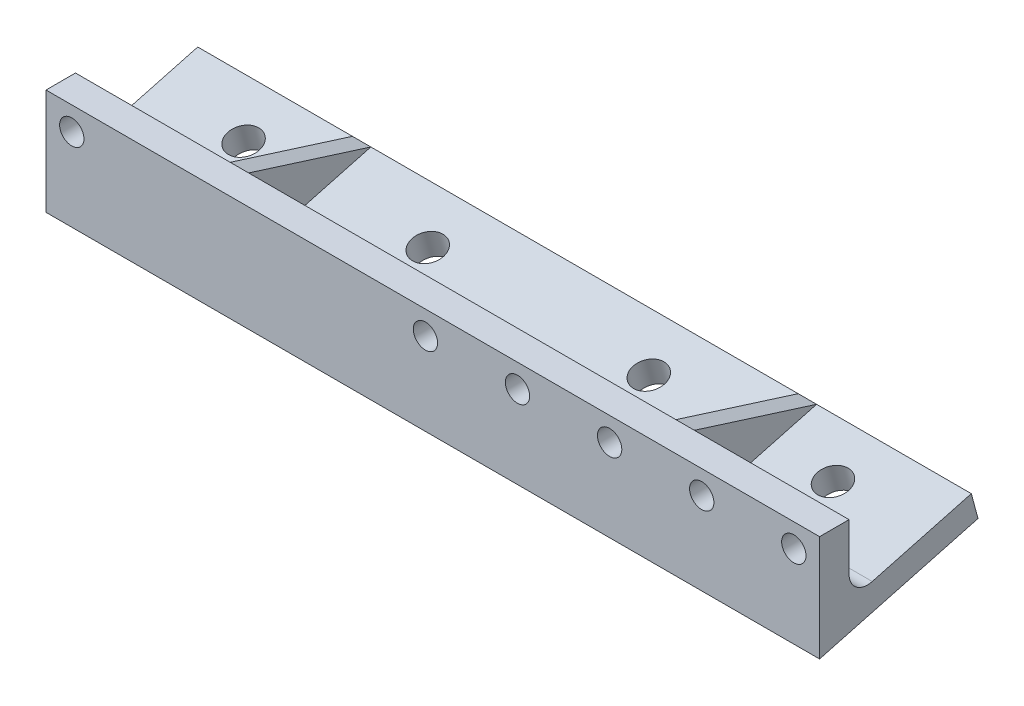
ISO-10303-21;
HEADER;
FILE_DESCRIPTION(('STEP AP214'),'2;1');
FILE_NAME('part.step','',(''),(''),'','','');
FILE_SCHEMA(('AUTOMOTIVE_DESIGN { 1 0 10303 214 1 1 1 1 }'));
ENDSEC;
DATA;
#1=APPLICATION_CONTEXT('core data for automotive mechanical design processes');
#2=APPLICATION_PROTOCOL_DEFINITION('international standard','automotive_design',2000,#1);
#3=PRODUCT_CONTEXT('',#1,'mechanical');
#4=PRODUCT('Part','Part','',(#3));
#5=PRODUCT_RELATED_PRODUCT_CATEGORY('part','',(#4));
#6=PRODUCT_DEFINITION_FORMATION('','',#4);
#7=PRODUCT_DEFINITION_CONTEXT('part definition',#1,'design');
#8=PRODUCT_DEFINITION('design','',#6,#7);
#9=PRODUCT_DEFINITION_SHAPE('','',#8);
#10=(LENGTH_UNIT() NAMED_UNIT(*) SI_UNIT(.MILLI.,.METRE.));
#11=(NAMED_UNIT(*) PLANE_ANGLE_UNIT() SI_UNIT($,.RADIAN.));
#12=(NAMED_UNIT(*) SI_UNIT($,.STERADIAN.) SOLID_ANGLE_UNIT());
#13=UNCERTAINTY_MEASURE_WITH_UNIT(LENGTH_MEASURE(1.E-05),#10,'distance_accuracy_value','');
#14=(GEOMETRIC_REPRESENTATION_CONTEXT(3) GLOBAL_UNCERTAINTY_ASSIGNED_CONTEXT((#13)) GLOBAL_UNIT_ASSIGNED_CONTEXT((#10,
#11,#12)) REPRESENTATION_CONTEXT('',''));
#15=CARTESIAN_POINT('',(0.,0.,0.));
#16=DIRECTION('',(0.,0.,1.));
#17=DIRECTION('',(1.,0.,0.));
#18=AXIS2_PLACEMENT_3D('',#15,#16,#17);
#19=CARTESIAN_POINT('',(158.,10.6217782649107,-60.));
#20=DIRECTION('',(0.,0.,1.));
#21=DIRECTION('',(1.,0.,0.));
#22=AXIS2_PLACEMENT_3D('',#19,#20,#21);
#23=PLANE('',#22);
#24=CARTESIAN_POINT('',(51.,23.65,-60.));
#25=DIRECTION('',(0.,0.,-1.));
#26=DIRECTION('',(-1.,0.,0.));
#27=AXIS2_PLACEMENT_3D('',#24,#25,#26);
#28=CIRCLE('',#27,3.3);
#29=CARTESIAN_POINT('',(47.7,23.65,-60.));
#30=VERTEX_POINT('',#29);
#31=EDGE_CURVE('E200',#30,#30,#28,.T.);
#32=ORIENTED_EDGE('',*,*,#31,.F.);
#33=EDGE_LOOP('',(#32));
#34=FACE_BOUND('',#33,.T.);
#35=CARTESIAN_POINT('',(76.,23.65,-60.));
#36=DIRECTION('',(0.,0.,-1.));
#37=DIRECTION('',(-1.,0.,0.));
#38=AXIS2_PLACEMENT_3D('',#35,#36,#37);
#39=CIRCLE('',#38,3.29999999999999);
#40=CARTESIAN_POINT('',(72.7,23.65,-60.));
#41=VERTEX_POINT('',#40);
#42=EDGE_CURVE('E229',#41,#41,#39,.T.);
#43=ORIENTED_EDGE('',*,*,#42,.F.);
#44=EDGE_LOOP('',(#43));
#45=FACE_BOUND('',#44,.T.);
#46=CARTESIAN_POINT('',(101.,23.65,-60.));
#47=DIRECTION('',(0.,0.,-1.));
#48=DIRECTION('',(-1.,0.,0.));
#49=AXIS2_PLACEMENT_3D('',#46,#47,#48);
#50=CIRCLE('',#49,3.3);
#51=CARTESIAN_POINT('',(97.7,23.65,-60.));
#52=VERTEX_POINT('',#51);
#53=EDGE_CURVE('E223',#52,#52,#50,.T.);
#54=ORIENTED_EDGE('',*,*,#53,.F.);
#55=EDGE_LOOP('',(#54));
#56=FACE_BOUND('',#55,.T.);
#57=DIRECTION('',(0.,1.,0.));
#58=VECTOR('',#57,1.);
#59=CARTESIAN_POINT('',(-4.99999999999999,26.2748809496813,-60.));
#60=LINE('',#59,#58);
#61=CARTESIAN_POINT('',(-4.99999999999998,17.1379051291167,-60.));
#62=VERTEX_POINT('',#61);
#63=CARTESIAN_POINT('',(-4.99999999999998,30.,-60.));
#64=VERTEX_POINT('',#63);
#65=EDGE_CURVE('E188',#62,#64,#60,.T.);
#66=ORIENTED_EDGE('',*,*,#65,.T.);
#67=DIRECTION('',(-1.,0.,0.));
#68=VECTOR('',#67,1.);
#69=CARTESIAN_POINT('',(158.,30.,-60.));
#70=LINE('',#69,#68);
#71=CARTESIAN_POINT('',(111.,30.,-60.));
#72=VERTEX_POINT('',#71);
#73=EDGE_CURVE('E332',#72,#64,#70,.T.);
#74=ORIENTED_EDGE('',*,*,#73,.F.);
#75=DIRECTION('',(0.,-1.,0.));
#76=VECTOR('',#75,1.);
#77=CARTESIAN_POINT('',(111.,30.,-60.));
#78=LINE('',#77,#76);
#79=CARTESIAN_POINT('',(111.,17.1379051291167,-60.));
#80=VERTEX_POINT('',#79);
#81=EDGE_CURVE('E250',#72,#80,#78,.T.);
#82=ORIENTED_EDGE('',*,*,#81,.T.);
#83=DIRECTION('',(-1.,0.,0.));
#84=VECTOR('',#83,1.);
#85=CARTESIAN_POINT('',(-52.,17.1379051291167,-60.));
#86=LINE('',#85,#84);
#87=EDGE_CURVE('E351',#80,#62,#86,.T.);
#88=ORIENTED_EDGE('',*,*,#87,.T.);
#89=EDGE_LOOP('',(#66,#74,#82,#88));
#90=FACE_BOUND('',#89,.T.);
#91=ADVANCED_FACE('F42',(#34,#45,#56,#90),#23,.F.);
#92=CARTESIAN_POINT('',(158.,20.,-95.));
#93=DIRECTION('',(0.,-0.965925826289068,-0.258819045102521));
#94=DIRECTION('',(0.,0.258819045102521,-0.965925826289068));
#95=AXIS2_PLACEMENT_3D('',#92,#93,#94);
#96=PLANE('',#95);
#97=CARTESIAN_POINT('',(23.,16.1498999348201,-80.6312309425245));
#98=DIRECTION('',(0.,0.965925826289068,0.258819045102521));
#99=DIRECTION('',(0.,-0.258819045102521,0.965925826289068));
#100=AXIS2_PLACEMENT_3D('',#97,#98,#99);
#101=CIRCLE('',#100,4.25000000000001);
#102=CARTESIAN_POINT('',(23.,15.0499189931344,-76.5260461807959));
#103=VERTEX_POINT('',#102);
#104=EDGE_CURVE('E285',#103,#103,#101,.T.);
#105=ORIENTED_EDGE('',*,*,#104,.F.);
#106=EDGE_LOOP('',(#105));
#107=FACE_BOUND('',#106,.T.);
#108=CARTESIAN_POINT('',(83.,16.1498999348201,-80.6312309425245));
#109=DIRECTION('',(0.,0.965925826289068,0.258819045102521));
#110=DIRECTION('',(0.,-0.258819045102521,0.965925826289068));
#111=AXIS2_PLACEMENT_3D('',#108,#109,#110);
#112=CIRCLE('',#111,4.25000000000001);
#113=CARTESIAN_POINT('',(83.,15.0499189931344,-76.5260461807959));
#114=VERTEX_POINT('',#113);
#115=EDGE_CURVE('E289',#114,#114,#112,.T.);
#116=ORIENTED_EDGE('',*,*,#115,.F.);
#117=EDGE_LOOP('',(#116));
#118=FACE_BOUND('',#117,.T.);
#119=DIRECTION('',(0.,-0.258819045102521,0.965925826289068));
#120=VECTOR('',#119,1.);
#121=CARTESIAN_POINT('',(-4.99999999999999,19.5145475211529,-93.1882666842824));
#122=LINE('',#121,#120);
#123=CARTESIAN_POINT('',(-4.99999999999998,19.5145475211529,-93.1882666842824));
#124=VERTEX_POINT('',#123);
#125=CARTESIAN_POINT('',(-4.99999999999998,12.3082759976714,-66.2940952255126));
#126=VERTEX_POINT('',#125);
#127=EDGE_CURVE('E179',#124,#126,#122,.T.);
#128=ORIENTED_EDGE('',*,*,#127,.T.);
#129=DIRECTION('',(-1.,0.,0.));
#130=VECTOR('',#129,1.);
#131=CARTESIAN_POINT('',(158.,12.3082759976714,-66.2940952255126));
#132=LINE('',#131,#130);
#133=CARTESIAN_POINT('',(111.,12.3082759976714,-66.2940952255126));
#134=VERTEX_POINT('',#133);
#135=EDGE_CURVE('E52',#126,#134,#132,.F.);
#136=ORIENTED_EDGE('',*,*,#135,.T.);
#137=DIRECTION('',(0.,0.258819045102521,-0.965925826289068));
#138=VECTOR('',#137,1.);
#139=CARTESIAN_POINT('',(111.,12.3082759976714,-66.2940952255126));
#140=LINE('',#139,#138);
#141=CARTESIAN_POINT('',(111.,19.5145475211529,-93.1882666842824));
#142=VERTEX_POINT('',#141);
#143=EDGE_CURVE('E262',#134,#142,#140,.T.);
#144=ORIENTED_EDGE('',*,*,#143,.T.);
#145=DIRECTION('',(-1.,0.,0.));
#146=VECTOR('',#145,1.);
#147=CARTESIAN_POINT('',(158.,19.5145475211529,-93.1882666842824));
#148=LINE('',#147,#146);
#149=EDGE_CURVE('E307',#142,#124,#148,.T.);
#150=ORIENTED_EDGE('',*,*,#149,.T.);
#151=EDGE_LOOP('',(#128,#136,#144,#150));
#152=FACE_BOUND('',#151,.T.);
#153=ADVANCED_FACE('F388',(#107,#118,#152),#96,.F.);
#154=CARTESIAN_POINT('',(158.,17.1379051291167,-65.));
#155=DIRECTION('',(1.,0.,0.));
#156=DIRECTION('',(0.,0.,-1.));
#157=AXIS2_PLACEMENT_3D('',#154,#155,#156);
#158=CYLINDRICAL_SURFACE('',#157,5.);
#159=CARTESIAN_POINT('',(-4.99999999999999,17.1379051291167,-65.));
#160=DIRECTION('',(-1.,0.,0.));
#161=DIRECTION('',(0.,0.,1.));
#162=AXIS2_PLACEMENT_3D('',#159,#160,#161);
#163=CIRCLE('',#162,5.);
#164=EDGE_CURVE('E69',#126,#62,#163,.T.);
#165=ORIENTED_EDGE('',*,*,#164,.T.);
#166=ORIENTED_EDGE('',*,*,#87,.F.);
#167=CARTESIAN_POINT('',(111.,17.1379051291167,-65.));
#168=DIRECTION('',(1.,0.,0.));
#169=DIRECTION('',(0.,0.,-1.));
#170=AXIS2_PLACEMENT_3D('',#167,#168,#169);
#171=CIRCLE('',#170,5.);
#172=EDGE_CURVE('E245',#80,#134,#171,.T.);
#173=ORIENTED_EDGE('',*,*,#172,.T.);
#174=ORIENTED_EDGE('',*,*,#135,.F.);
#175=EDGE_LOOP('',(#165,#166,#173,#174));
#176=FACE_BOUND('',#175,.T.);
#177=ADVANCED_FACE('F396',(#176),#158,.F.);
#178=CARTESIAN_POINT('',(-45.,23.65,-60.));
#179=DIRECTION('',(0.,0.,-1.));
#180=DIRECTION('',(-1.,0.,0.));
#181=AXIS2_PLACEMENT_3D('',#178,#179,#180);
#182=CIRCLE('',#181,3.3);
#183=CARTESIAN_POINT('',(-48.3,23.65,-60.));
#184=VERTEX_POINT('',#183);
#185=EDGE_CURVE('E205',#184,#184,#182,.T.);
#186=ORIENTED_EDGE('',*,*,#185,.F.);
#187=EDGE_LOOP('',(#186));
#188=FACE_BOUND('',#187,.T.);
#189=DIRECTION('',(-1.,0.,0.));
#190=VECTOR('',#189,1.);
#191=CARTESIAN_POINT('',(-47.,30.,-60.));
#192=LINE('',#191,#190);
#193=CARTESIAN_POINT('',(-9.99999999999998,30.,-60.));
#194=VERTEX_POINT('',#193);
#195=CARTESIAN_POINT('',(-52.,30.,-60.));
#196=VERTEX_POINT('',#195);
#197=EDGE_CURVE('E299',#194,#196,#192,.T.);
#198=ORIENTED_EDGE('',*,*,#197,.F.);
#199=DIRECTION('',(0.,1.,0.));
#200=VECTOR('',#199,1.);
#201=CARTESIAN_POINT('',(-9.99999999999998,17.1379051291167,-60.));
#202=LINE('',#201,#200);
#203=CARTESIAN_POINT('',(-9.99999999999998,17.1379051291167,-60.));
#204=VERTEX_POINT('',#203);
#205=EDGE_CURVE('E61',#204,#194,#202,.T.);
#206=ORIENTED_EDGE('',*,*,#205,.F.);
#207=CARTESIAN_POINT('',(-52.,17.1379051291167,-60.));
#208=VERTEX_POINT('',#207);
#209=EDGE_CURVE('E347',#204,#208,#86,.T.);
#210=ORIENTED_EDGE('',*,*,#209,.T.);
#211=DIRECTION('',(0.,-1.,0.));
#212=VECTOR('',#211,1.);
#213=CARTESIAN_POINT('',(-52.,30.,-60.));
#214=LINE('',#213,#212);
#215=EDGE_CURVE('E171',#196,#208,#214,.T.);
#216=ORIENTED_EDGE('',*,*,#215,.F.);
#217=EDGE_LOOP('',(#198,#206,#210,#216));
#218=FACE_BOUND('',#217,.T.);
#219=ADVANCED_FACE('F391',(#188,#218),#23,.F.);
#220=CARTESIAN_POINT('',(-27.,16.1498999348201,-80.6312309425245));
#221=DIRECTION('',(0.,0.965925826289068,0.258819045102521));
#222=DIRECTION('',(0.,-0.258819045102521,0.965925826289068));
#223=AXIS2_PLACEMENT_3D('',#220,#221,#222);
#224=CIRCLE('',#223,4.25000000000001);
#225=CARTESIAN_POINT('',(-27.,15.0499189931344,-76.5260461807959));
#226=VERTEX_POINT('',#225);
#227=EDGE_CURVE('E280',#226,#226,#224,.T.);
#228=ORIENTED_EDGE('',*,*,#227,.F.);
#229=EDGE_LOOP('',(#228));
#230=FACE_BOUND('',#229,.T.);
#231=CARTESIAN_POINT('',(-52.,12.3082759976714,-66.2940952255126));
#232=VERTEX_POINT('',#231);
#233=CARTESIAN_POINT('',(-9.99999999999998,12.3082759976714,-66.2940952255126));
#234=VERTEX_POINT('',#233);
#235=EDGE_CURVE('E11',#232,#234,#132,.F.);
#236=ORIENTED_EDGE('',*,*,#235,.T.);
#237=DIRECTION('',(0.,-0.258819045102521,0.965925826289068));
#238=VECTOR('',#237,1.);
#239=CARTESIAN_POINT('',(-9.99999999999998,19.5145475211529,-93.1882666842824));
#240=LINE('',#239,#238);
#241=CARTESIAN_POINT('',(-9.99999999999998,19.5145475211529,-93.1882666842824));
#242=VERTEX_POINT('',#241);
#243=EDGE_CURVE('E184',#242,#234,#240,.T.);
#244=ORIENTED_EDGE('',*,*,#243,.F.);
#245=DIRECTION('',(-1.,0.,0.));
#246=VECTOR('',#245,1.);
#247=CARTESIAN_POINT('',(-47.,19.5145475211529,-93.1882666842824));
#248=LINE('',#247,#246);
#249=CARTESIAN_POINT('',(-52.,19.5145475211529,-93.1882666842824));
#250=VERTEX_POINT('',#249);
#251=EDGE_CURVE('E167',#242,#250,#248,.T.);
#252=ORIENTED_EDGE('',*,*,#251,.T.);
#253=DIRECTION('',(0.,0.258819045102521,-0.965925826289068));
#254=VECTOR('',#253,1.);
#255=CARTESIAN_POINT('',(-52.,12.3082759976714,-66.2940952255126));
#256=LINE('',#255,#254);
#257=EDGE_CURVE('E165',#232,#250,#256,.T.);
#258=ORIENTED_EDGE('',*,*,#257,.F.);
#259=EDGE_LOOP('',(#236,#244,#252,#258));
#260=FACE_BOUND('',#259,.T.);
#261=ADVANCED_FACE('F166',(#230,#260),#96,.F.);
#262=ORIENTED_EDGE('',*,*,#209,.F.);
#263=CARTESIAN_POINT('',(-9.99999999999998,17.1379051291167,-65.));
#264=DIRECTION('',(-1.,0.,0.));
#265=DIRECTION('',(0.,0.,1.));
#266=AXIS2_PLACEMENT_3D('',#263,#264,#265);
#267=CIRCLE('',#266,5.);
#268=EDGE_CURVE('E160',#234,#204,#267,.T.);
#269=ORIENTED_EDGE('',*,*,#268,.F.);
#270=ORIENTED_EDGE('',*,*,#235,.F.);
#271=CARTESIAN_POINT('',(-52.,17.1379051291167,-65.));
#272=DIRECTION('',(1.,0.,0.));
#273=DIRECTION('',(0.,0.,-1.));
#274=AXIS2_PLACEMENT_3D('',#271,#272,#273);
#275=CIRCLE('',#274,5.);
#276=EDGE_CURVE('E157',#208,#232,#275,.T.);
#277=ORIENTED_EDGE('',*,*,#276,.F.);
#278=EDGE_LOOP('',(#262,#269,#270,#277));
#279=FACE_BOUND('',#278,.T.);
#280=ADVANCED_FACE('F155',(#279),#158,.F.);
#281=CARTESIAN_POINT('',(151.,23.65,-60.));
#282=DIRECTION('',(0.,0.,-1.));
#283=DIRECTION('',(-1.,0.,0.));
#284=AXIS2_PLACEMENT_3D('',#281,#282,#283);
#285=CIRCLE('',#284,3.3);
#286=CARTESIAN_POINT('',(147.7,23.65,-60.));
#287=VERTEX_POINT('',#286);
#288=EDGE_CURVE('E211',#287,#287,#285,.T.);
#289=ORIENTED_EDGE('',*,*,#288,.F.);
#290=EDGE_LOOP('',(#289));
#291=FACE_BOUND('',#290,.T.);
#292=CARTESIAN_POINT('',(126.,23.65,-60.));
#293=DIRECTION('',(0.,0.,-1.));
#294=DIRECTION('',(-1.,0.,0.));
#295=AXIS2_PLACEMENT_3D('',#292,#293,#294);
#296=CIRCLE('',#295,3.3);
#297=CARTESIAN_POINT('',(122.7,23.65,-60.));
#298=VERTEX_POINT('',#297);
#299=EDGE_CURVE('E217',#298,#298,#296,.T.);
#300=ORIENTED_EDGE('',*,*,#299,.F.);
#301=EDGE_LOOP('',(#300));
#302=FACE_BOUND('',#301,.T.);
#303=CARTESIAN_POINT('',(158.,17.1379051291167,-60.));
#304=VERTEX_POINT('',#303);
#305=CARTESIAN_POINT('',(116.,17.1379051291167,-60.));
#306=VERTEX_POINT('',#305);
#307=EDGE_CURVE('E348',#304,#306,#86,.T.);
#308=ORIENTED_EDGE('',*,*,#307,.T.);
#309=DIRECTION('',(0.,-1.,0.));
#310=VECTOR('',#309,1.);
#311=CARTESIAN_POINT('',(116.,30.,-60.));
#312=LINE('',#311,#310);
#313=CARTESIAN_POINT('',(116.,30.,-60.));
#314=VERTEX_POINT('',#313);
#315=EDGE_CURVE('E256',#314,#306,#312,.T.);
#316=ORIENTED_EDGE('',*,*,#315,.F.);
#317=CARTESIAN_POINT('',(158.,30.,-60.));
#318=VERTEX_POINT('',#317);
#319=EDGE_CURVE('E336',#318,#314,#70,.T.);
#320=ORIENTED_EDGE('',*,*,#319,.F.);
#321=DIRECTION('',(0.,1.,0.));
#322=VECTOR('',#321,1.);
#323=CARTESIAN_POINT('',(158.,17.1379051291167,-60.));
#324=LINE('',#323,#322);
#325=EDGE_CURVE('E239',#304,#318,#324,.T.);
#326=ORIENTED_EDGE('',*,*,#325,.F.);
#327=EDGE_LOOP('',(#308,#316,#320,#326));
#328=FACE_BOUND('',#327,.T.);
#329=ADVANCED_FACE('F392',(#291,#302,#328),#23,.F.);
#330=CARTESIAN_POINT('',(133.,16.1498999348201,-80.6312309425245));
#331=DIRECTION('',(0.,0.965925826289068,0.258819045102521));
#332=DIRECTION('',(0.,-0.258819045102521,0.965925826289068));
#333=AXIS2_PLACEMENT_3D('',#330,#331,#332);
#334=CIRCLE('',#333,4.25000000000001);
#335=CARTESIAN_POINT('',(133.,15.0499189931344,-76.5260461807959));
#336=VERTEX_POINT('',#335);
#337=EDGE_CURVE('E279',#336,#336,#334,.T.);
#338=ORIENTED_EDGE('',*,*,#337,.F.);
#339=EDGE_LOOP('',(#338));
#340=FACE_BOUND('',#339,.T.);
#341=CARTESIAN_POINT('',(158.,19.5145475211529,-93.1882666842824));
#342=VERTEX_POINT('',#341);
#343=CARTESIAN_POINT('',(116.,19.5145475211529,-93.1882666842824));
#344=VERTEX_POINT('',#343);
#345=EDGE_CURVE('E310',#342,#344,#148,.T.);
#346=ORIENTED_EDGE('',*,*,#345,.T.);
#347=DIRECTION('',(0.,0.258819045102521,-0.965925826289068));
#348=VECTOR('',#347,1.);
#349=CARTESIAN_POINT('',(116.,12.3082759976714,-66.2940952255126));
#350=LINE('',#349,#348);
#351=CARTESIAN_POINT('',(116.,12.3082759976714,-66.2940952255126));
#352=VERTEX_POINT('',#351);
#353=EDGE_CURVE('E249',#352,#344,#350,.T.);
#354=ORIENTED_EDGE('',*,*,#353,.F.);
#355=CARTESIAN_POINT('',(158.,12.3082759976714,-66.2940952255126));
#356=VERTEX_POINT('',#355);
#357=EDGE_CURVE('E54',#352,#356,#132,.F.);
#358=ORIENTED_EDGE('',*,*,#357,.T.);
#359=DIRECTION('',(0.,-0.258819045102521,0.965925826289068));
#360=VECTOR('',#359,1.);
#361=CARTESIAN_POINT('',(158.,19.5145475211529,-93.1882666842824));
#362=LINE('',#361,#360);
#363=EDGE_CURVE('E242',#342,#356,#362,.T.);
#364=ORIENTED_EDGE('',*,*,#363,.F.);
#365=EDGE_LOOP('',(#346,#354,#358,#364));
#366=FACE_BOUND('',#365,.T.);
#367=ADVANCED_FACE('F399',(#340,#366),#96,.F.);
#368=ORIENTED_EDGE('',*,*,#357,.F.);
#369=CARTESIAN_POINT('',(116.,17.1379051291167,-65.));
#370=DIRECTION('',(1.,0.,0.));
#371=DIRECTION('',(0.,0.,-1.));
#372=AXIS2_PLACEMENT_3D('',#369,#370,#371);
#373=CIRCLE('',#372,5.);
#374=EDGE_CURVE('E246',#306,#352,#373,.T.);
#375=ORIENTED_EDGE('',*,*,#374,.F.);
#376=ORIENTED_EDGE('',*,*,#307,.F.);
#377=CARTESIAN_POINT('',(158.,17.1379051291167,-65.));
#378=DIRECTION('',(-1.,0.,0.));
#379=DIRECTION('',(0.,0.,1.));
#380=AXIS2_PLACEMENT_3D('',#377,#378,#379);
#381=CIRCLE('',#380,5.);
#382=EDGE_CURVE('E204',#356,#304,#381,.T.);
#383=ORIENTED_EDGE('',*,*,#382,.F.);
#384=EDGE_LOOP('',(#368,#375,#376,#383));
#385=FACE_BOUND('',#384,.T.);
#386=ADVANCED_FACE('F44',(#385),#158,.F.);
#387=CARTESIAN_POINT('',(160.,30.,-31.93));
#388=DIRECTION('',(0.,1.,0.));
#389=DIRECTION('',(0.,0.,1.));
#390=AXIS2_PLACEMENT_3D('',#387,#388,#389);
#391=PLANE('',#390);
#392=DIRECTION('',(-1.,0.,0.));
#393=VECTOR('',#392,1.);
#394=CARTESIAN_POINT('',(160.,30.,-52.));
#395=LINE('',#394,#393);
#396=CARTESIAN_POINT('',(158.,30.,-52.));
#397=VERTEX_POINT('',#396);
#398=CARTESIAN_POINT('',(-52.,30.,-52.));
#399=VERTEX_POINT('',#398);
#400=EDGE_CURVE('E276',#397,#399,#395,.T.);
#401=ORIENTED_EDGE('',*,*,#400,.F.);
#402=DIRECTION('',(0.,0.,1.));
#403=VECTOR('',#402,1.);
#404=CARTESIAN_POINT('',(158.,30.,0.));
#405=LINE('',#404,#403);
#406=EDGE_CURVE('E343',#318,#397,#405,.T.);
#407=ORIENTED_EDGE('',*,*,#406,.F.);
#408=ORIENTED_EDGE('',*,*,#319,.T.);
#409=DIRECTION('',(-1.,0.,0.));
#410=VECTOR('',#409,1.);
#411=CARTESIAN_POINT('',(116.,30.,-60.));
#412=LINE('',#411,#410);
#413=EDGE_CURVE('E259',#314,#72,#412,.T.);
#414=ORIENTED_EDGE('',*,*,#413,.T.);
#415=ORIENTED_EDGE('',*,*,#73,.T.);
#416=DIRECTION('',(1.,0.,0.));
#417=VECTOR('',#416,1.);
#418=CARTESIAN_POINT('',(-9.99999999999998,30.,-60.));
#419=LINE('',#418,#417);
#420=EDGE_CURVE('E196',#194,#64,#419,.T.);
#421=ORIENTED_EDGE('',*,*,#420,.F.);
#422=ORIENTED_EDGE('',*,*,#197,.T.);
#423=DIRECTION('',(0.,0.,1.));
#424=VECTOR('',#423,1.);
#425=CARTESIAN_POINT('',(-52.,30.,0.));
#426=LINE('',#425,#424);
#427=EDGE_CURVE('E339',#196,#399,#426,.T.);
#428=ORIENTED_EDGE('',*,*,#427,.T.);
#429=EDGE_LOOP('',(#401,#407,#408,#414,#415,#421,#422,#428));
#430=FACE_BOUND('',#429,.T.);
#431=ADVANCED_FACE('F428',(#430),#391,.T.);
#432=CARTESIAN_POINT('',(158.,0.,0.));
#433=DIRECTION('',(-1.,0.,0.));
#434=DIRECTION('',(0.,0.,1.));
#435=AXIS2_PLACEMENT_3D('',#432,#433,#434);
#436=PLANE('',#435);
#437=DIRECTION('',(0.,0.965925826289068,0.25881904510252));
#438=VECTOR('',#437,1.);
#439=CARTESIAN_POINT('',(158.,12.7530667371294,-95.));
#440=LINE('',#439,#438);
#441=CARTESIAN_POINT('',(158.,12.7530667371294,-95.));
#442=VERTEX_POINT('',#441);
#443=EDGE_CURVE('E303',#442,#342,#440,.T.);
#444=ORIENTED_EDGE('',*,*,#443,.T.);
#445=ORIENTED_EDGE('',*,*,#363,.T.);
#446=ORIENTED_EDGE('',*,*,#382,.T.);
#447=ORIENTED_EDGE('',*,*,#325,.T.);
#448=ORIENTED_EDGE('',*,*,#406,.T.);
#449=DIRECTION('',(0.,-1.,0.));
#450=VECTOR('',#449,1.);
#451=CARTESIAN_POINT('',(158.,17.3,-52.));
#452=LINE('',#451,#450);
#453=CARTESIAN_POINT('',(158.,1.2312514625911,-52.));
#454=VERTEX_POINT('',#453);
#455=EDGE_CURVE('E314',#397,#454,#452,.T.);
#456=ORIENTED_EDGE('',*,*,#455,.T.);
#457=DIRECTION('',(0.,0.258819045102521,-0.965925826289068));
#458=VECTOR('',#457,1.);
#459=CARTESIAN_POINT('',(158.,12.7530667371294,-95.));
#460=LINE('',#459,#458);
#461=EDGE_CURVE('E321',#454,#442,#460,.T.);
#462=ORIENTED_EDGE('',*,*,#461,.T.);
#463=EDGE_LOOP('',(#444,#445,#446,#447,#448,#456,#462));
#464=FACE_BOUND('',#463,.T.);
#465=ADVANCED_FACE('F432',(#464),#436,.F.);
#466=CARTESIAN_POINT('',(-52.,0.,0.));
#467=DIRECTION('',(-1.,0.,0.));
#468=DIRECTION('',(0.,0.,1.));
#469=AXIS2_PLACEMENT_3D('',#466,#467,#468);
#470=PLANE('',#469);
#471=ORIENTED_EDGE('',*,*,#215,.T.);
#472=ORIENTED_EDGE('',*,*,#276,.T.);
#473=ORIENTED_EDGE('',*,*,#257,.T.);
#474=DIRECTION('',(0.,0.965925826289068,0.25881904510252));
#475=VECTOR('',#474,1.);
#476=CARTESIAN_POINT('',(-52.,12.7530667371294,-95.));
#477=LINE('',#476,#475);
#478=CARTESIAN_POINT('',(-52.,12.7530667371294,-95.));
#479=VERTEX_POINT('',#478);
#480=EDGE_CURVE('E298',#479,#250,#477,.T.);
#481=ORIENTED_EDGE('',*,*,#480,.F.);
#482=DIRECTION('',(0.,0.258819045102521,-0.965925826289068));
#483=VECTOR('',#482,1.);
#484=CARTESIAN_POINT('',(-52.,12.7530667371294,-95.));
#485=LINE('',#484,#483);
#486=CARTESIAN_POINT('',(-52.,1.2312514625911,-52.));
#487=VERTEX_POINT('',#486);
#488=EDGE_CURVE('E318',#487,#479,#485,.T.);
#489=ORIENTED_EDGE('',*,*,#488,.F.);
#490=DIRECTION('',(0.,-1.,0.));
#491=VECTOR('',#490,1.);
#492=CARTESIAN_POINT('',(-52.,17.3,-52.));
#493=LINE('',#492,#491);
#494=EDGE_CURVE('E313',#399,#487,#493,.T.);
#495=ORIENTED_EDGE('',*,*,#494,.F.);
#496=ORIENTED_EDGE('',*,*,#427,.F.);
#497=EDGE_LOOP('',(#471,#472,#473,#481,#489,#495,#496));
#498=FACE_BOUND('',#497,.T.);
#499=ADVANCED_FACE('F173',(#498),#470,.T.);
#500=CARTESIAN_POINT('',(158.,12.7530667371294,-95.));
#501=DIRECTION('',(0.,0.965925826289068,0.258819045102521));
#502=DIRECTION('',(0.,-0.258819045102521,0.965925826289068));
#503=AXIS2_PLACEMENT_3D('',#500,#501,#502);
#504=PLANE('',#503);
#505=CARTESIAN_POINT('',(-27.,9.38841915079663,-82.4429642582421));
#506=DIRECTION('',(0.,0.965925826289068,0.258819045102521));
#507=DIRECTION('',(0.,-0.258819045102521,0.965925826289068));
#508=AXIS2_PLACEMENT_3D('',#505,#506,#507);
#509=CIRCLE('',#508,4.25000000000001);
#510=CARTESIAN_POINT('',(-27.,8.28843820911091,-78.3377794965136));
#511=VERTEX_POINT('',#510);
#512=EDGE_CURVE('E46',#511,#511,#509,.T.);
#513=ORIENTED_EDGE('',*,*,#512,.T.);
#514=EDGE_LOOP('',(#513));
#515=FACE_BOUND('',#514,.T.);
#516=CARTESIAN_POINT('',(23.,9.38841915079663,-82.4429642582421));
#517=DIRECTION('',(0.,0.965925826289068,0.258819045102521));
#518=DIRECTION('',(0.,-0.258819045102521,0.965925826289068));
#519=AXIS2_PLACEMENT_3D('',#516,#517,#518);
#520=CIRCLE('',#519,4.25000000000001);
#521=CARTESIAN_POINT('',(23.,8.28843820911091,-78.3377794965136));
#522=VERTEX_POINT('',#521);
#523=EDGE_CURVE('E359',#522,#522,#520,.T.);
#524=ORIENTED_EDGE('',*,*,#523,.T.);
#525=EDGE_LOOP('',(#524));
#526=FACE_BOUND('',#525,.T.);
#527=CARTESIAN_POINT('',(83.,9.38841915079663,-82.4429642582421));
#528=DIRECTION('',(0.,0.965925826289068,0.258819045102521));
#529=DIRECTION('',(0.,-0.258819045102521,0.965925826289068));
#530=AXIS2_PLACEMENT_3D('',#527,#528,#529);
#531=CIRCLE('',#530,4.25000000000001);
#532=CARTESIAN_POINT('',(83.,8.28843820911091,-78.3377794965136));
#533=VERTEX_POINT('',#532);
#534=EDGE_CURVE('E356',#533,#533,#531,.T.);
#535=ORIENTED_EDGE('',*,*,#534,.T.);
#536=EDGE_LOOP('',(#535));
#537=FACE_BOUND('',#536,.T.);
#538=CARTESIAN_POINT('',(133.,9.38841915079663,-82.4429642582421));
#539=DIRECTION('',(0.,0.965925826289068,0.258819045102521));
#540=DIRECTION('',(0.,-0.258819045102521,0.965925826289068));
#541=AXIS2_PLACEMENT_3D('',#538,#539,#540);
#542=CIRCLE('',#541,4.25000000000001);
#543=CARTESIAN_POINT('',(133.,8.28843820911091,-78.3377794965136));
#544=VERTEX_POINT('',#543);
#545=EDGE_CURVE('E284',#544,#544,#542,.T.);
#546=ORIENTED_EDGE('',*,*,#545,.T.);
#547=EDGE_LOOP('',(#546));
#548=FACE_BOUND('',#547,.T.);
#549=ORIENTED_EDGE('',*,*,#488,.T.);
#550=DIRECTION('',(-1.,0.,0.));
#551=VECTOR('',#550,1.);
#552=CARTESIAN_POINT('',(158.,12.7530667371294,-95.));
#553=LINE('',#552,#551);
#554=EDGE_CURVE('E329',#442,#479,#553,.T.);
#555=ORIENTED_EDGE('',*,*,#554,.F.);
#556=ORIENTED_EDGE('',*,*,#461,.F.);
#557=DIRECTION('',(-1.,0.,0.));
#558=VECTOR('',#557,1.);
#559=CARTESIAN_POINT('',(158.,1.2312514625911,-52.));
#560=LINE('',#559,#558);
#561=EDGE_CURVE('E325',#454,#487,#560,.T.);
#562=ORIENTED_EDGE('',*,*,#561,.T.);
#563=EDGE_LOOP('',(#549,#555,#556,#562));
#564=FACE_BOUND('',#563,.T.);
#565=ADVANCED_FACE('F369',(#515,#526,#537,#548,#564),#504,.F.);
#566=CARTESIAN_POINT('',(158.,17.3,-52.));
#567=DIRECTION('',(0.,0.,-1.));
#568=DIRECTION('',(-1.,0.,0.));
#569=AXIS2_PLACEMENT_3D('',#566,#567,#568);
#570=PLANE('',#569);
#571=CARTESIAN_POINT('',(-45.,23.65,-52.));
#572=DIRECTION('',(0.,0.,-1.));
#573=DIRECTION('',(-1.,0.,0.));
#574=AXIS2_PLACEMENT_3D('',#571,#572,#573);
#575=CIRCLE('',#574,3.3);
#576=CARTESIAN_POINT('',(-48.3,23.65,-52.));
#577=VERTEX_POINT('',#576);
#578=EDGE_CURVE('E201',#577,#577,#575,.T.);
#579=ORIENTED_EDGE('',*,*,#578,.T.);
#580=EDGE_LOOP('',(#579));
#581=FACE_BOUND('',#580,.T.);
#582=CARTESIAN_POINT('',(151.,23.65,-52.));
#583=DIRECTION('',(0.,0.,-1.));
#584=DIRECTION('',(-1.,0.,0.));
#585=AXIS2_PLACEMENT_3D('',#582,#583,#584);
#586=CIRCLE('',#585,3.3);
#587=CARTESIAN_POINT('',(147.7,23.65,-52.));
#588=VERTEX_POINT('',#587);
#589=EDGE_CURVE('E208',#588,#588,#586,.T.);
#590=ORIENTED_EDGE('',*,*,#589,.T.);
#591=EDGE_LOOP('',(#590));
#592=FACE_BOUND('',#591,.T.);
#593=CARTESIAN_POINT('',(126.,23.65,-52.));
#594=DIRECTION('',(0.,0.,-1.));
#595=DIRECTION('',(-1.,0.,0.));
#596=AXIS2_PLACEMENT_3D('',#593,#594,#595);
#597=CIRCLE('',#596,3.3);
#598=CARTESIAN_POINT('',(122.7,23.65,-52.));
#599=VERTEX_POINT('',#598);
#600=EDGE_CURVE('E214',#599,#599,#597,.T.);
#601=ORIENTED_EDGE('',*,*,#600,.T.);
#602=EDGE_LOOP('',(#601));
#603=FACE_BOUND('',#602,.T.);
#604=CARTESIAN_POINT('',(101.,23.65,-52.));
#605=DIRECTION('',(0.,0.,-1.));
#606=DIRECTION('',(-1.,0.,0.));
#607=AXIS2_PLACEMENT_3D('',#604,#605,#606);
#608=CIRCLE('',#607,3.3);
#609=CARTESIAN_POINT('',(97.7,23.65,-52.));
#610=VERTEX_POINT('',#609);
#611=EDGE_CURVE('E220',#610,#610,#608,.T.);
#612=ORIENTED_EDGE('',*,*,#611,.T.);
#613=EDGE_LOOP('',(#612));
#614=FACE_BOUND('',#613,.T.);
#615=CARTESIAN_POINT('',(76.,23.65,-52.));
#616=DIRECTION('',(0.,0.,-1.));
#617=DIRECTION('',(-1.,0.,0.));
#618=AXIS2_PLACEMENT_3D('',#615,#616,#617);
#619=CIRCLE('',#618,3.29999999999999);
#620=CARTESIAN_POINT('',(72.7,23.65,-52.));
#621=VERTEX_POINT('',#620);
#622=EDGE_CURVE('E226',#621,#621,#619,.T.);
#623=ORIENTED_EDGE('',*,*,#622,.T.);
#624=EDGE_LOOP('',(#623));
#625=FACE_BOUND('',#624,.T.);
#626=CARTESIAN_POINT('',(51.,23.65,-52.));
#627=DIRECTION('',(0.,0.,-1.));
#628=DIRECTION('',(-1.,0.,0.));
#629=AXIS2_PLACEMENT_3D('',#626,#627,#628);
#630=CIRCLE('',#629,3.3);
#631=CARTESIAN_POINT('',(47.7,23.65,-52.));
#632=VERTEX_POINT('',#631);
#633=EDGE_CURVE('E232',#632,#632,#630,.T.);
#634=ORIENTED_EDGE('',*,*,#633,.T.);
#635=EDGE_LOOP('',(#634));
#636=FACE_BOUND('',#635,.T.);
#637=ORIENTED_EDGE('',*,*,#455,.F.);
#638=ORIENTED_EDGE('',*,*,#400,.T.);
#639=ORIENTED_EDGE('',*,*,#494,.T.);
#640=ORIENTED_EDGE('',*,*,#561,.F.);
#641=EDGE_LOOP('',(#637,#638,#639,#640));
#642=FACE_BOUND('',#641,.T.);
#643=ADVANCED_FACE('F593',(#581,#592,#603,#614,#625,#636,#642),#570,.F.);
#644=CARTESIAN_POINT('',(158.,12.7530667371294,-95.));
#645=DIRECTION('',(0.,-0.25881904510252,0.965925826289068));
#646=DIRECTION('',(0.,-0.965925826289068,-0.25881904510252));
#647=AXIS2_PLACEMENT_3D('',#644,#645,#646);
#648=PLANE('',#647);
#649=ORIENTED_EDGE('',*,*,#480,.T.);
#650=ORIENTED_EDGE('',*,*,#251,.F.);
#651=DIRECTION('',(1.,0.,0.));
#652=VECTOR('',#651,1.);
#653=CARTESIAN_POINT('',(-9.99999999999998,19.5145475211529,-93.1882666842824));
#654=LINE('',#653,#652);
#655=EDGE_CURVE('E186',#242,#124,#654,.T.);
#656=ORIENTED_EDGE('',*,*,#655,.T.);
#657=ORIENTED_EDGE('',*,*,#149,.F.);
#658=DIRECTION('',(-1.,0.,0.));
#659=VECTOR('',#658,1.);
#660=CARTESIAN_POINT('',(116.,19.5145475211529,-93.1882666842824));
#661=LINE('',#660,#659);
#662=EDGE_CURVE('E272',#344,#142,#661,.T.);
#663=ORIENTED_EDGE('',*,*,#662,.F.);
#664=ORIENTED_EDGE('',*,*,#345,.F.);
#665=ORIENTED_EDGE('',*,*,#443,.F.);
#666=ORIENTED_EDGE('',*,*,#554,.T.);
#667=EDGE_LOOP('',(#649,#650,#656,#657,#663,#664,#665,#666));
#668=FACE_BOUND('',#667,.T.);
#669=ADVANCED_FACE('F588',(#668),#648,.F.);
#670=CARTESIAN_POINT('',(133.,-2.51035410302427,-85.6312309425245));
#671=DIRECTION('',(0.,0.965925826289068,0.258819045102521));
#672=DIRECTION('',(0.,-0.258819045102521,0.965925826289068));
#673=AXIS2_PLACEMENT_3D('',#670,#671,#672);
#674=CYLINDRICAL_SURFACE('',#673,4.25000000000001);
#675=ORIENTED_EDGE('',*,*,#337,.T.);
#676=EDGE_LOOP('',(#675));
#677=FACE_BOUND('',#676,.T.);
#678=ORIENTED_EDGE('',*,*,#545,.F.);
#679=EDGE_LOOP('',(#678));
#680=FACE_BOUND('',#679,.T.);
#681=ADVANCED_FACE('F592',(#677,#680),#674,.F.);
#682=CARTESIAN_POINT('',(83.,-2.51035410302427,-85.6312309425245));
#683=DIRECTION('',(0.,0.965925826289068,0.258819045102521));
#684=DIRECTION('',(0.,-0.258819045102521,0.965925826289068));
#685=AXIS2_PLACEMENT_3D('',#682,#683,#684);
#686=CYLINDRICAL_SURFACE('',#685,4.25000000000001);
#687=ORIENTED_EDGE('',*,*,#115,.T.);
#688=EDGE_LOOP('',(#687));
#689=FACE_BOUND('',#688,.T.);
#690=ORIENTED_EDGE('',*,*,#534,.F.);
#691=EDGE_LOOP('',(#690));
#692=FACE_BOUND('',#691,.T.);
#693=ADVANCED_FACE('F384',(#689,#692),#686,.F.);
#694=CARTESIAN_POINT('',(23.,-2.51035410302427,-85.6312309425245));
#695=DIRECTION('',(0.,0.965925826289068,0.258819045102521));
#696=DIRECTION('',(0.,-0.258819045102521,0.965925826289068));
#697=AXIS2_PLACEMENT_3D('',#694,#695,#696);
#698=CYLINDRICAL_SURFACE('',#697,4.25000000000001);
#699=ORIENTED_EDGE('',*,*,#104,.T.);
#700=EDGE_LOOP('',(#699));
#701=FACE_BOUND('',#700,.T.);
#702=ORIENTED_EDGE('',*,*,#523,.F.);
#703=EDGE_LOOP('',(#702));
#704=FACE_BOUND('',#703,.T.);
#705=ADVANCED_FACE('F374',(#701,#704),#698,.F.);
#706=CARTESIAN_POINT('',(-27.,-2.51035410302427,-85.6312309425245));
#707=DIRECTION('',(0.,0.965925826289068,0.258819045102521));
#708=DIRECTION('',(0.,-0.258819045102521,0.965925826289068));
#709=AXIS2_PLACEMENT_3D('',#706,#707,#708);
#710=CYLINDRICAL_SURFACE('',#709,4.25000000000001);
#711=ORIENTED_EDGE('',*,*,#227,.T.);
#712=EDGE_LOOP('',(#711));
#713=FACE_BOUND('',#712,.T.);
#714=ORIENTED_EDGE('',*,*,#512,.F.);
#715=EDGE_LOOP('',(#714));
#716=FACE_BOUND('',#715,.T.);
#717=ADVANCED_FACE('F371',(#713,#716),#710,.F.);
#718=CARTESIAN_POINT('',(116.,19.5145475211529,-93.1882666842824));
#719=DIRECTION('',(0.,-0.95354184042704,0.301260615671901));
#720=DIRECTION('',(0.,-0.301260615671901,-0.95354184042704));
#721=AXIS2_PLACEMENT_3D('',#718,#719,#720);
#722=PLANE('',#721);
#723=DIRECTION('',(0.,0.301260615671901,0.95354184042704));
#724=VECTOR('',#723,1.);
#725=CARTESIAN_POINT('',(111.,19.5145475211529,-93.1882666842824));
#726=LINE('',#725,#724);
#727=EDGE_CURVE('E265',#142,#72,#726,.T.);
#728=ORIENTED_EDGE('',*,*,#727,.T.);
#729=ORIENTED_EDGE('',*,*,#413,.F.);
#730=DIRECTION('',(0.,0.301260615671901,0.95354184042704));
#731=VECTOR('',#730,1.);
#732=CARTESIAN_POINT('',(116.,19.5145475211529,-93.1882666842824));
#733=LINE('',#732,#731);
#734=EDGE_CURVE('E253',#344,#314,#733,.T.);
#735=ORIENTED_EDGE('',*,*,#734,.F.);
#736=ORIENTED_EDGE('',*,*,#662,.T.);
#737=EDGE_LOOP('',(#728,#729,#735,#736));
#738=FACE_BOUND('',#737,.T.);
#739=ADVANCED_FACE('F373',(#738),#722,.F.);
#740=CARTESIAN_POINT('',(116.,17.1379051291167,-65.));
#741=DIRECTION('',(1.,0.,0.));
#742=DIRECTION('',(0.,0.,-1.));
#743=AXIS2_PLACEMENT_3D('',#740,#741,#742);
#744=PLANE('',#743);
#745=ORIENTED_EDGE('',*,*,#374,.T.);
#746=ORIENTED_EDGE('',*,*,#353,.T.);
#747=ORIENTED_EDGE('',*,*,#734,.T.);
#748=ORIENTED_EDGE('',*,*,#315,.T.);
#749=EDGE_LOOP('',(#745,#746,#747,#748));
#750=FACE_BOUND('',#749,.T.);
#751=ADVANCED_FACE('F381',(#750),#744,.T.);
#752=CARTESIAN_POINT('',(111.,17.1379051291167,-65.));
#753=DIRECTION('',(1.,0.,0.));
#754=DIRECTION('',(0.,0.,-1.));
#755=AXIS2_PLACEMENT_3D('',#752,#753,#754);
#756=PLANE('',#755);
#757=ORIENTED_EDGE('',*,*,#172,.F.);
#758=ORIENTED_EDGE('',*,*,#81,.F.);
#759=ORIENTED_EDGE('',*,*,#727,.F.);
#760=ORIENTED_EDGE('',*,*,#143,.F.);
#761=EDGE_LOOP('',(#757,#758,#759,#760));
#762=FACE_BOUND('',#761,.T.);
#763=ADVANCED_FACE('F446',(#762),#756,.F.);
#764=CARTESIAN_POINT('',(-45.,23.65,-52.));
#765=DIRECTION('',(0.,0.,-1.));
#766=DIRECTION('',(-1.,0.,0.));
#767=AXIS2_PLACEMENT_3D('',#764,#765,#766);
#768=CYLINDRICAL_SURFACE('',#767,3.3);
#769=ORIENTED_EDGE('',*,*,#578,.F.);
#770=EDGE_LOOP('',(#769));
#771=FACE_BOUND('',#770,.T.);
#772=ORIENTED_EDGE('',*,*,#185,.T.);
#773=EDGE_LOOP('',(#772));
#774=FACE_BOUND('',#773,.T.);
#775=ADVANCED_FACE('F470',(#771,#774),#768,.F.);
#776=CARTESIAN_POINT('',(51.,23.65,-52.));
#777=DIRECTION('',(0.,0.,-1.));
#778=DIRECTION('',(-1.,0.,0.));
#779=AXIS2_PLACEMENT_3D('',#776,#777,#778);
#780=CYLINDRICAL_SURFACE('',#779,3.3);
#781=ORIENTED_EDGE('',*,*,#633,.F.);
#782=EDGE_LOOP('',(#781));
#783=FACE_BOUND('',#782,.T.);
#784=ORIENTED_EDGE('',*,*,#31,.T.);
#785=EDGE_LOOP('',(#784));
#786=FACE_BOUND('',#785,.T.);
#787=ADVANCED_FACE('F473',(#783,#786),#780,.F.);
#788=CARTESIAN_POINT('',(76.,23.65,-52.));
#789=DIRECTION('',(0.,0.,-1.));
#790=DIRECTION('',(-1.,0.,0.));
#791=AXIS2_PLACEMENT_3D('',#788,#789,#790);
#792=CYLINDRICAL_SURFACE('',#791,3.29999999999999);
#793=ORIENTED_EDGE('',*,*,#622,.F.);
#794=EDGE_LOOP('',(#793));
#795=FACE_BOUND('',#794,.T.);
#796=ORIENTED_EDGE('',*,*,#42,.T.);
#797=EDGE_LOOP('',(#796));
#798=FACE_BOUND('',#797,.T.);
#799=ADVANCED_FACE('F485',(#795,#798),#792,.F.);
#800=CARTESIAN_POINT('',(101.,23.65,-52.));
#801=DIRECTION('',(0.,0.,-1.));
#802=DIRECTION('',(-1.,0.,0.));
#803=AXIS2_PLACEMENT_3D('',#800,#801,#802);
#804=CYLINDRICAL_SURFACE('',#803,3.3);
#805=ORIENTED_EDGE('',*,*,#611,.F.);
#806=EDGE_LOOP('',(#805));
#807=FACE_BOUND('',#806,.T.);
#808=ORIENTED_EDGE('',*,*,#53,.T.);
#809=EDGE_LOOP('',(#808));
#810=FACE_BOUND('',#809,.T.);
#811=ADVANCED_FACE('F481',(#807,#810),#804,.F.);
#812=CARTESIAN_POINT('',(126.,23.65,-52.));
#813=DIRECTION('',(0.,0.,-1.));
#814=DIRECTION('',(-1.,0.,0.));
#815=AXIS2_PLACEMENT_3D('',#812,#813,#814);
#816=CYLINDRICAL_SURFACE('',#815,3.3);
#817=ORIENTED_EDGE('',*,*,#600,.F.);
#818=EDGE_LOOP('',(#817));
#819=FACE_BOUND('',#818,.T.);
#820=ORIENTED_EDGE('',*,*,#299,.T.);
#821=EDGE_LOOP('',(#820));
#822=FACE_BOUND('',#821,.T.);
#823=ADVANCED_FACE('F477',(#819,#822),#816,.F.);
#824=CARTESIAN_POINT('',(151.,23.65,-52.));
#825=DIRECTION('',(0.,0.,-1.));
#826=DIRECTION('',(-1.,0.,0.));
#827=AXIS2_PLACEMENT_3D('',#824,#825,#826);
#828=CYLINDRICAL_SURFACE('',#827,3.3);
#829=ORIENTED_EDGE('',*,*,#589,.F.);
#830=EDGE_LOOP('',(#829));
#831=FACE_BOUND('',#830,.T.);
#832=ORIENTED_EDGE('',*,*,#288,.T.);
#833=EDGE_LOOP('',(#832));
#834=FACE_BOUND('',#833,.T.);
#835=ADVANCED_FACE('F469',(#831,#834),#828,.F.);
#836=CARTESIAN_POINT('',(-9.99999999999998,30.,-60.));
#837=DIRECTION('',(0.,-0.95354184042704,0.301260615671901));
#838=DIRECTION('',(0.,-0.301260615671901,-0.95354184042704));
#839=AXIS2_PLACEMENT_3D('',#836,#837,#838);
#840=PLANE('',#839);
#841=DIRECTION('',(0.,-0.301260615671901,-0.95354184042704));
#842=VECTOR('',#841,1.);
#843=CARTESIAN_POINT('',(-4.99999999999999,30.,-60.));
#844=LINE('',#843,#842);
#845=EDGE_CURVE('E190',#64,#124,#844,.T.);
#846=ORIENTED_EDGE('',*,*,#845,.T.);
#847=ORIENTED_EDGE('',*,*,#655,.F.);
#848=DIRECTION('',(0.,-0.301260615671901,-0.95354184042704));
#849=VECTOR('',#848,1.);
#850=CARTESIAN_POINT('',(-9.99999999999998,30.,-60.));
#851=LINE('',#850,#849);
#852=EDGE_CURVE('E181',#194,#242,#851,.T.);
#853=ORIENTED_EDGE('',*,*,#852,.F.);
#854=ORIENTED_EDGE('',*,*,#420,.T.);
#855=EDGE_LOOP('',(#846,#847,#853,#854));
#856=FACE_BOUND('',#855,.T.);
#857=ADVANCED_FACE('F454',(#856),#840,.F.);
#858=CARTESIAN_POINT('',(-9.99999999999998,17.1379051291167,-65.));
#859=DIRECTION('',(-1.,0.,0.));
#860=DIRECTION('',(0.,0.,1.));
#861=AXIS2_PLACEMENT_3D('',#858,#859,#860);
#862=PLANE('',#861);
#863=ORIENTED_EDGE('',*,*,#268,.T.);
#864=ORIENTED_EDGE('',*,*,#205,.T.);
#865=ORIENTED_EDGE('',*,*,#852,.T.);
#866=ORIENTED_EDGE('',*,*,#243,.T.);
#867=EDGE_LOOP('',(#863,#864,#865,#866));
#868=FACE_BOUND('',#867,.T.);
#869=ADVANCED_FACE('F459',(#868),#862,.T.);
#870=CARTESIAN_POINT('',(-4.99999999999999,17.1379051291167,-65.));
#871=DIRECTION('',(-1.,0.,0.));
#872=DIRECTION('',(0.,0.,1.));
#873=AXIS2_PLACEMENT_3D('',#870,#871,#872);
#874=PLANE('',#873);
#875=ORIENTED_EDGE('',*,*,#164,.F.);
#876=ORIENTED_EDGE('',*,*,#127,.F.);
#877=ORIENTED_EDGE('',*,*,#845,.F.);
#878=ORIENTED_EDGE('',*,*,#65,.F.);
#879=EDGE_LOOP('',(#875,#876,#877,#878));
#880=FACE_BOUND('',#879,.T.);
#881=ADVANCED_FACE('F457',(#880),#874,.F.);
#882=CLOSED_SHELL('',(#91,#153,#177,#219,#261,#280,#329,#367,#386,#431,#465,#499,#565,#643,#669,
#681,#693,#705,#717,#739,#751,#763,#775,#787,#799,#811,#823,#835,#857,#869,#881));
#883=MANIFOLD_SOLID_BREP('B2',#882);
#884=ADVANCED_BREP_SHAPE_REPRESENTATION('',(#18,#883),#14);
#885=SHAPE_DEFINITION_REPRESENTATION(#9,#884);
ENDSEC;
END-ISO-10303-21;
